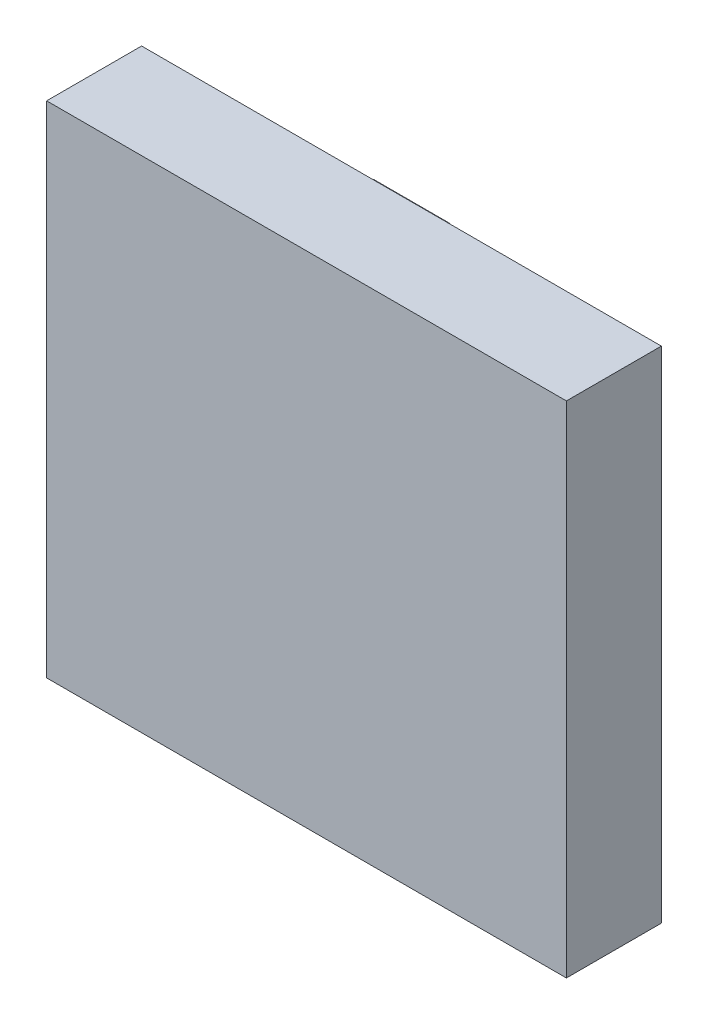
ISO-10303-21;
HEADER;
FILE_DESCRIPTION(('STEP AP214'),'2;1');
FILE_NAME('part.step','',(''),(''),'','','');
FILE_SCHEMA(('AUTOMOTIVE_DESIGN { 1 0 10303 214 1 1 1 1 }'));
ENDSEC;
DATA;
#1=APPLICATION_CONTEXT('core data for automotive mechanical design processes');
#2=APPLICATION_PROTOCOL_DEFINITION('international standard','automotive_design',2000,#1);
#3=PRODUCT_CONTEXT('',#1,'mechanical');
#4=PRODUCT('Part','Part','',(#3));
#5=PRODUCT_RELATED_PRODUCT_CATEGORY('part','',(#4));
#6=PRODUCT_DEFINITION_FORMATION('','',#4);
#7=PRODUCT_DEFINITION_CONTEXT('part definition',#1,'design');
#8=PRODUCT_DEFINITION('design','',#6,#7);
#9=PRODUCT_DEFINITION_SHAPE('','',#8);
#10=(LENGTH_UNIT() NAMED_UNIT(*) SI_UNIT(.MILLI.,.METRE.));
#11=(NAMED_UNIT(*) PLANE_ANGLE_UNIT() SI_UNIT($,.RADIAN.));
#12=(NAMED_UNIT(*) SI_UNIT($,.STERADIAN.) SOLID_ANGLE_UNIT());
#13=UNCERTAINTY_MEASURE_WITH_UNIT(LENGTH_MEASURE(1.E-05),#10,'distance_accuracy_value','');
#14=(GEOMETRIC_REPRESENTATION_CONTEXT(3) GLOBAL_UNCERTAINTY_ASSIGNED_CONTEXT((#13)) GLOBAL_UNIT_ASSIGNED_CONTEXT((#10,
#11,#12)) REPRESENTATION_CONTEXT('',''));
#15=CARTESIAN_POINT('',(0.,0.,0.));
#16=DIRECTION('',(0.,0.,1.));
#17=DIRECTION('',(1.,0.,0.));
#18=AXIS2_PLACEMENT_3D('',#15,#16,#17);
#19=CARTESIAN_POINT('',(0.,0.,1.05));
#20=DIRECTION('',(0.,0.,-1.));
#21=DIRECTION('',(0.,-1.,0.));
#22=AXIS2_PLACEMENT_3D('',#19,#20,#21);
#23=PLANE('',#22);
#24=DIRECTION('',(0.,1.,0.));
#25=VECTOR('',#24,1.);
#26=CARTESIAN_POINT('',(-2.6,-2.5,1.05));
#27=LINE('',#26,#25);
#28=CARTESIAN_POINT('',(-2.6,-2.5,1.05));
#29=VERTEX_POINT('',#28);
#30=CARTESIAN_POINT('',(-2.6,2.5,1.05));
#31=VERTEX_POINT('',#30);
#32=EDGE_CURVE('P0_E25',#29,#31,#27,.T.);
#33=ORIENTED_EDGE('',*,*,#32,.F.);
#34=DIRECTION('',(-1.,0.,0.));
#35=VECTOR('',#34,1.);
#36=CARTESIAN_POINT('',(2.6,-2.5,1.05));
#37=LINE('',#36,#35);
#38=CARTESIAN_POINT('',(2.6,-2.5,1.05));
#39=VERTEX_POINT('',#38);
#40=EDGE_CURVE('P0_E66',#39,#29,#37,.T.);
#41=ORIENTED_EDGE('',*,*,#40,.F.);
#42=DIRECTION('',(0.,-1.,0.));
#43=VECTOR('',#42,1.);
#44=CARTESIAN_POINT('',(2.6,2.5,1.05));
#45=LINE('',#44,#43);
#46=CARTESIAN_POINT('',(2.6,2.5,1.05));
#47=VERTEX_POINT('',#46);
#48=EDGE_CURVE('P0_E69',#47,#39,#45,.T.);
#49=ORIENTED_EDGE('',*,*,#48,.F.);
#50=DIRECTION('',(1.,0.,0.));
#51=VECTOR('',#50,1.);
#52=CARTESIAN_POINT('',(-2.6,2.5,1.05));
#53=LINE('',#52,#51);
#54=EDGE_CURVE('P0_E112',#31,#47,#53,.T.);
#55=ORIENTED_EDGE('',*,*,#54,.F.);
#56=EDGE_LOOP('',(#33,#41,#49,#55));
#57=FACE_BOUND('',#56,.T.);
#58=ADVANCED_FACE('P0_F17',(#57),#23,.F.);
#59=CARTESIAN_POINT('',(0.,0.,0.1));
#60=DIRECTION('',(0.,0.,-1.));
#61=DIRECTION('',(0.,-1.,0.));
#62=AXIS2_PLACEMENT_3D('',#59,#60,#61);
#63=PLANE('',#62);
#64=DIRECTION('',(1.,0.,0.));
#65=VECTOR('',#64,1.);
#66=CARTESIAN_POINT('',(-2.6,2.5,0.1));
#67=LINE('',#66,#65);
#68=CARTESIAN_POINT('',(-2.6,2.5,0.1));
#69=VERTEX_POINT('',#68);
#70=CARTESIAN_POINT('',(2.6,2.5,0.1));
#71=VERTEX_POINT('',#70);
#72=EDGE_CURVE('P0_E90',#69,#71,#67,.T.);
#73=ORIENTED_EDGE('',*,*,#72,.T.);
#74=DIRECTION('',(0.,-1.,0.));
#75=VECTOR('',#74,1.);
#76=CARTESIAN_POINT('',(2.6,2.5,0.1));
#77=LINE('',#76,#75);
#78=CARTESIAN_POINT('',(2.6,-2.5,0.1));
#79=VERTEX_POINT('',#78);
#80=EDGE_CURVE('P0_E75',#71,#79,#77,.T.);
#81=ORIENTED_EDGE('',*,*,#80,.T.);
#82=DIRECTION('',(-1.,0.,0.));
#83=VECTOR('',#82,1.);
#84=CARTESIAN_POINT('',(2.6,-2.5,0.1));
#85=LINE('',#84,#83);
#86=CARTESIAN_POINT('',(-2.6,-2.5,0.1));
#87=VERTEX_POINT('',#86);
#88=EDGE_CURVE('P0_E80',#79,#87,#85,.T.);
#89=ORIENTED_EDGE('',*,*,#88,.T.);
#90=DIRECTION('',(0.,1.,0.));
#91=VECTOR('',#90,1.);
#92=CARTESIAN_POINT('',(-2.6,-2.5,0.1));
#93=LINE('',#92,#91);
#94=EDGE_CURVE('P0_E11',#87,#69,#93,.T.);
#95=ORIENTED_EDGE('',*,*,#94,.T.);
#96=EDGE_LOOP('',(#73,#81,#89,#95));
#97=FACE_BOUND('',#96,.T.);
#98=ADVANCED_FACE('P0_F107',(#97),#63,.T.);
#99=CARTESIAN_POINT('',(-2.6,-2.5,0.1));
#100=DIRECTION('',(-1.,0.,0.));
#101=DIRECTION('',(0.,0.,1.));
#102=AXIS2_PLACEMENT_3D('',#99,#100,#101);
#103=PLANE('',#102);
#104=DIRECTION('',(0.,0.,1.));
#105=VECTOR('',#104,1.);
#106=CARTESIAN_POINT('',(-2.6,-2.5,0.1));
#107=LINE('',#106,#105);
#108=EDGE_CURVE('P0_E74',#87,#29,#107,.T.);
#109=ORIENTED_EDGE('',*,*,#108,.T.);
#110=ORIENTED_EDGE('',*,*,#32,.T.);
#111=DIRECTION('',(0.,0.,1.));
#112=VECTOR('',#111,1.);
#113=CARTESIAN_POINT('',(-2.6,2.5,0.1));
#114=LINE('',#113,#112);
#115=EDGE_CURVE('P0_E111',#69,#31,#114,.T.);
#116=ORIENTED_EDGE('',*,*,#115,.F.);
#117=ORIENTED_EDGE('',*,*,#94,.F.);
#118=EDGE_LOOP('',(#109,#110,#116,#117));
#119=FACE_BOUND('',#118,.T.);
#120=ADVANCED_FACE('P0_F109',(#119),#103,.T.);
#121=CARTESIAN_POINT('',(2.6,-2.5,0.1));
#122=DIRECTION('',(0.,-1.,0.));
#123=DIRECTION('',(0.,0.,-1.));
#124=AXIS2_PLACEMENT_3D('',#121,#122,#123);
#125=PLANE('',#124);
#126=DIRECTION('',(0.,0.,1.));
#127=VECTOR('',#126,1.);
#128=CARTESIAN_POINT('',(2.6,-2.5,0.1));
#129=LINE('',#128,#127);
#130=EDGE_CURVE('P0_E78',#79,#39,#129,.T.);
#131=ORIENTED_EDGE('',*,*,#130,.T.);
#132=ORIENTED_EDGE('',*,*,#40,.T.);
#133=ORIENTED_EDGE('',*,*,#108,.F.);
#134=ORIENTED_EDGE('',*,*,#88,.F.);
#135=EDGE_LOOP('',(#131,#132,#133,#134));
#136=FACE_BOUND('',#135,.T.);
#137=ADVANCED_FACE('P0_F79',(#136),#125,.T.);
#138=CARTESIAN_POINT('',(2.6,2.5,0.1));
#139=DIRECTION('',(1.,0.,0.));
#140=DIRECTION('',(0.,1.,0.));
#141=AXIS2_PLACEMENT_3D('',#138,#139,#140);
#142=PLANE('',#141);
#143=DIRECTION('',(0.,0.,1.));
#144=VECTOR('',#143,1.);
#145=CARTESIAN_POINT('',(2.6,2.5,0.1));
#146=LINE('',#145,#144);
#147=EDGE_CURVE('P0_E87',#71,#47,#146,.T.);
#148=ORIENTED_EDGE('',*,*,#147,.T.);
#149=ORIENTED_EDGE('',*,*,#48,.T.);
#150=ORIENTED_EDGE('',*,*,#130,.F.);
#151=ORIENTED_EDGE('',*,*,#80,.F.);
#152=EDGE_LOOP('',(#148,#149,#150,#151));
#153=FACE_BOUND('',#152,.T.);
#154=ADVANCED_FACE('P0_F85',(#153),#142,.T.);
#155=CARTESIAN_POINT('',(-2.6,2.5,0.1));
#156=DIRECTION('',(0.,1.,0.));
#157=DIRECTION('',(1.,0.,0.));
#158=AXIS2_PLACEMENT_3D('',#155,#156,#157);
#159=PLANE('',#158);
#160=ORIENTED_EDGE('',*,*,#115,.T.);
#161=ORIENTED_EDGE('',*,*,#54,.T.);
#162=ORIENTED_EDGE('',*,*,#147,.F.);
#163=ORIENTED_EDGE('',*,*,#72,.F.);
#164=EDGE_LOOP('',(#160,#161,#162,#163));
#165=FACE_BOUND('',#164,.T.);
#166=ADVANCED_FACE('P0_F116',(#165),#159,.T.);
#167=CLOSED_SHELL('',(#58,#98,#120,#137,#154,#166));
#168=MANIFOLD_SOLID_BREP('P0_B1',#167);
#169=CARTESIAN_POINT('',(-2.4275,-2.0575,0.1));
#170=DIRECTION('',(0.,0.,1.));
#171=DIRECTION('',(1.,0.,0.));
#172=AXIS2_PLACEMENT_3D('',#169,#170,#171);
#173=PLANE('',#172);
#174=DIRECTION('',(0.,1.,0.));
#175=VECTOR('',#174,1.);
#176=CARTESIAN_POINT('',(-2.4275,-2.0575,0.1));
#177=LINE('',#176,#175);
#178=CARTESIAN_POINT('',(-2.4275,-2.0575,0.1));
#179=VERTEX_POINT('',#178);
#180=CARTESIAN_POINT('',(-2.4275,2.0575,0.1));
#181=VERTEX_POINT('',#180);
#182=EDGE_CURVE('P1_E87',#179,#181,#177,.T.);
#183=ORIENTED_EDGE('',*,*,#182,.F.);
#184=DIRECTION('',(1.,0.,0.));
#185=VECTOR('',#184,1.);
#186=CARTESIAN_POINT('',(-2.4275,-2.0575,0.1));
#187=LINE('',#186,#185);
#188=CARTESIAN_POINT('',(-1.0475,-2.0575,0.1));
#189=VERTEX_POINT('',#188);
#190=EDGE_CURVE('P1_E70',#179,#189,#187,.T.);
#191=ORIENTED_EDGE('',*,*,#190,.T.);
#192=DIRECTION('',(0.,1.,0.));
#193=VECTOR('',#192,1.);
#194=CARTESIAN_POINT('',(-1.0475,-2.0575,0.1));
#195=LINE('',#194,#193);
#196=CARTESIAN_POINT('',(-1.0475,2.0575,0.1));
#197=VERTEX_POINT('',#196);
#198=EDGE_CURVE('P1_E82',#189,#197,#195,.T.);
#199=ORIENTED_EDGE('',*,*,#198,.T.);
#200=DIRECTION('',(1.,0.,0.));
#201=VECTOR('',#200,1.);
#202=CARTESIAN_POINT('',(-2.4275,2.0575,0.1));
#203=LINE('',#202,#201);
#204=EDGE_CURVE('P1_E11',#181,#197,#203,.T.);
#205=ORIENTED_EDGE('',*,*,#204,.F.);
#206=EDGE_LOOP('',(#183,#191,#199,#205));
#207=FACE_BOUND('',#206,.T.);
#208=ADVANCED_FACE('P1_F17',(#207),#173,.T.);
#209=CARTESIAN_POINT('',(-2.4275,-2.0575,0.));
#210=DIRECTION('',(0.,0.,1.));
#211=DIRECTION('',(1.,0.,0.));
#212=AXIS2_PLACEMENT_3D('',#209,#210,#211);
#213=PLANE('',#212);
#214=DIRECTION('',(1.,0.,0.));
#215=VECTOR('',#214,1.);
#216=CARTESIAN_POINT('',(-2.4275,2.0575,0.));
#217=LINE('',#216,#215);
#218=CARTESIAN_POINT('',(-2.4275,2.0575,0.));
#219=VERTEX_POINT('',#218);
#220=CARTESIAN_POINT('',(-1.0475,2.0575,0.));
#221=VERTEX_POINT('',#220);
#222=EDGE_CURVE('P1_E25',#219,#221,#217,.T.);
#223=ORIENTED_EDGE('',*,*,#222,.T.);
#224=DIRECTION('',(0.,1.,0.));
#225=VECTOR('',#224,1.);
#226=CARTESIAN_POINT('',(-1.0475,-2.0575,0.));
#227=LINE('',#226,#225);
#228=CARTESIAN_POINT('',(-1.0475,-2.0575,0.));
#229=VERTEX_POINT('',#228);
#230=EDGE_CURVE('P1_E109',#229,#221,#227,.T.);
#231=ORIENTED_EDGE('',*,*,#230,.F.);
#232=DIRECTION('',(1.,0.,0.));
#233=VECTOR('',#232,1.);
#234=CARTESIAN_POINT('',(-2.4275,-2.0575,0.));
#235=LINE('',#234,#233);
#236=CARTESIAN_POINT('',(-2.4275,-2.0575,0.));
#237=VERTEX_POINT('',#236);
#238=EDGE_CURVE('P1_E81',#237,#229,#235,.T.);
#239=ORIENTED_EDGE('',*,*,#238,.F.);
#240=DIRECTION('',(0.,1.,0.));
#241=VECTOR('',#240,1.);
#242=CARTESIAN_POINT('',(-2.4275,-2.0575,0.));
#243=LINE('',#242,#241);
#244=EDGE_CURVE('P1_E88',#237,#219,#243,.T.);
#245=ORIENTED_EDGE('',*,*,#244,.T.);
#246=EDGE_LOOP('',(#223,#231,#239,#245));
#247=FACE_BOUND('',#246,.T.);
#248=ADVANCED_FACE('P1_F120',(#247),#213,.F.);
#249=CARTESIAN_POINT('',(-2.4275,2.0575,0.));
#250=DIRECTION('',(0.,1.,0.));
#251=DIRECTION('',(1.,0.,0.));
#252=AXIS2_PLACEMENT_3D('',#249,#250,#251);
#253=PLANE('',#252);
#254=ORIENTED_EDGE('',*,*,#222,.F.);
#255=DIRECTION('',(0.,0.,1.));
#256=VECTOR('',#255,1.);
#257=CARTESIAN_POINT('',(-2.4275,2.0575,0.));
#258=LINE('',#257,#256);
#259=EDGE_CURVE('P1_E92',#219,#181,#258,.T.);
#260=ORIENTED_EDGE('',*,*,#259,.T.);
#261=ORIENTED_EDGE('',*,*,#204,.T.);
#262=DIRECTION('',(0.,0.,1.));
#263=VECTOR('',#262,1.);
#264=CARTESIAN_POINT('',(-1.0475,2.0575,0.));
#265=LINE('',#264,#263);
#266=EDGE_CURVE('P1_E101',#221,#197,#265,.T.);
#267=ORIENTED_EDGE('',*,*,#266,.F.);
#268=EDGE_LOOP('',(#254,#260,#261,#267));
#269=FACE_BOUND('',#268,.T.);
#270=ADVANCED_FACE('P1_F119',(#269),#253,.T.);
#271=CARTESIAN_POINT('',(-2.4275,-2.0575,0.));
#272=DIRECTION('',(0.,1.,0.));
#273=DIRECTION('',(1.,0.,0.));
#274=AXIS2_PLACEMENT_3D('',#271,#272,#273);
#275=PLANE('',#274);
#276=DIRECTION('',(0.,0.,1.));
#277=VECTOR('',#276,1.);
#278=CARTESIAN_POINT('',(-1.0475,-2.0575,0.));
#279=LINE('',#278,#277);
#280=EDGE_CURVE('P1_E76',#229,#189,#279,.T.);
#281=ORIENTED_EDGE('',*,*,#280,.T.);
#282=ORIENTED_EDGE('',*,*,#190,.F.);
#283=DIRECTION('',(0.,0.,1.));
#284=VECTOR('',#283,1.);
#285=CARTESIAN_POINT('',(-2.4275,-2.0575,0.));
#286=LINE('',#285,#284);
#287=EDGE_CURVE('P1_E73',#237,#179,#286,.T.);
#288=ORIENTED_EDGE('',*,*,#287,.F.);
#289=ORIENTED_EDGE('',*,*,#238,.T.);
#290=EDGE_LOOP('',(#281,#282,#288,#289));
#291=FACE_BOUND('',#290,.T.);
#292=ADVANCED_FACE('P1_F72',(#291),#275,.F.);
#293=CARTESIAN_POINT('',(-1.0475,-2.0575,0.));
#294=DIRECTION('',(1.,0.,0.));
#295=DIRECTION('',(0.,1.,0.));
#296=AXIS2_PLACEMENT_3D('',#293,#294,#295);
#297=PLANE('',#296);
#298=ORIENTED_EDGE('',*,*,#280,.F.);
#299=ORIENTED_EDGE('',*,*,#230,.T.);
#300=ORIENTED_EDGE('',*,*,#266,.T.);
#301=ORIENTED_EDGE('',*,*,#198,.F.);
#302=EDGE_LOOP('',(#298,#299,#300,#301));
#303=FACE_BOUND('',#302,.T.);
#304=ADVANCED_FACE('P1_F118',(#303),#297,.T.);
#305=CARTESIAN_POINT('',(-2.4275,-2.0575,0.));
#306=DIRECTION('',(1.,0.,0.));
#307=DIRECTION('',(0.,1.,0.));
#308=AXIS2_PLACEMENT_3D('',#305,#306,#307);
#309=PLANE('',#308);
#310=ORIENTED_EDGE('',*,*,#182,.T.);
#311=ORIENTED_EDGE('',*,*,#259,.F.);
#312=ORIENTED_EDGE('',*,*,#244,.F.);
#313=ORIENTED_EDGE('',*,*,#287,.T.);
#314=EDGE_LOOP('',(#310,#311,#312,#313));
#315=FACE_BOUND('',#314,.T.);
#316=ADVANCED_FACE('P1_F85',(#315),#309,.F.);
#317=CLOSED_SHELL('',(#208,#248,#270,#292,#304,#316));
#318=MANIFOLD_SOLID_BREP('P1_B1',#317);
#319=CARTESIAN_POINT('',(1.0475,-2.0575,0.1));
#320=DIRECTION('',(0.,0.,1.));
#321=DIRECTION('',(1.,0.,0.));
#322=AXIS2_PLACEMENT_3D('',#319,#320,#321);
#323=PLANE('',#322);
#324=DIRECTION('',(0.,1.,0.));
#325=VECTOR('',#324,1.);
#326=CARTESIAN_POINT('',(1.0475,-2.0575,0.1));
#327=LINE('',#326,#325);
#328=CARTESIAN_POINT('',(1.0475,-2.0575,0.1));
#329=VERTEX_POINT('',#328);
#330=CARTESIAN_POINT('',(1.0475,2.0575,0.1));
#331=VERTEX_POINT('',#330);
#332=EDGE_CURVE('P2_E89',#329,#331,#327,.T.);
#333=ORIENTED_EDGE('',*,*,#332,.F.);
#334=DIRECTION('',(1.,0.,0.));
#335=VECTOR('',#334,1.);
#336=CARTESIAN_POINT('',(1.0475,-2.0575,0.1));
#337=LINE('',#336,#335);
#338=CARTESIAN_POINT('',(2.4275,-2.0575,0.1));
#339=VERTEX_POINT('',#338);
#340=EDGE_CURVE('P2_E71',#329,#339,#337,.T.);
#341=ORIENTED_EDGE('',*,*,#340,.T.);
#342=DIRECTION('',(0.,1.,0.));
#343=VECTOR('',#342,1.);
#344=CARTESIAN_POINT('',(2.4275,-2.0575,0.1));
#345=LINE('',#344,#343);
#346=CARTESIAN_POINT('',(2.4275,2.0575,0.1));
#347=VERTEX_POINT('',#346);
#348=EDGE_CURVE('P2_E83',#339,#347,#345,.T.);
#349=ORIENTED_EDGE('',*,*,#348,.T.);
#350=DIRECTION('',(1.,0.,0.));
#351=VECTOR('',#350,1.);
#352=CARTESIAN_POINT('',(1.0475,2.0575,0.1));
#353=LINE('',#352,#351);
#354=EDGE_CURVE('P2_E11',#331,#347,#353,.T.);
#355=ORIENTED_EDGE('',*,*,#354,.F.);
#356=EDGE_LOOP('',(#333,#341,#349,#355));
#357=FACE_BOUND('',#356,.T.);
#358=ADVANCED_FACE('P2_F17',(#357),#323,.T.);
#359=CARTESIAN_POINT('',(1.0475,-2.0575,0.));
#360=DIRECTION('',(0.,0.,1.));
#361=DIRECTION('',(1.,0.,0.));
#362=AXIS2_PLACEMENT_3D('',#359,#360,#361);
#363=PLANE('',#362);
#364=DIRECTION('',(1.,0.,0.));
#365=VECTOR('',#364,1.);
#366=CARTESIAN_POINT('',(1.0475,2.0575,0.));
#367=LINE('',#366,#365);
#368=CARTESIAN_POINT('',(1.0475,2.0575,0.));
#369=VERTEX_POINT('',#368);
#370=CARTESIAN_POINT('',(2.4275,2.0575,0.));
#371=VERTEX_POINT('',#370);
#372=EDGE_CURVE('P2_E20',#369,#371,#367,.T.);
#373=ORIENTED_EDGE('',*,*,#372,.T.);
#374=DIRECTION('',(0.,1.,0.));
#375=VECTOR('',#374,1.);
#376=CARTESIAN_POINT('',(2.4275,-2.0575,0.));
#377=LINE('',#376,#375);
#378=CARTESIAN_POINT('',(2.4275,-2.0575,0.));
#379=VERTEX_POINT('',#378);
#380=EDGE_CURVE('P2_E104',#379,#371,#377,.T.);
#381=ORIENTED_EDGE('',*,*,#380,.F.);
#382=DIRECTION('',(1.,0.,0.));
#383=VECTOR('',#382,1.);
#384=CARTESIAN_POINT('',(1.0475,-2.0575,0.));
#385=LINE('',#384,#383);
#386=CARTESIAN_POINT('',(1.0475,-2.0575,0.));
#387=VERTEX_POINT('',#386);
#388=EDGE_CURVE('P2_E82',#387,#379,#385,.T.);
#389=ORIENTED_EDGE('',*,*,#388,.F.);
#390=DIRECTION('',(0.,1.,0.));
#391=VECTOR('',#390,1.);
#392=CARTESIAN_POINT('',(1.0475,-2.0575,0.));
#393=LINE('',#392,#391);
#394=EDGE_CURVE('P2_E90',#387,#369,#393,.T.);
#395=ORIENTED_EDGE('',*,*,#394,.T.);
#396=EDGE_LOOP('',(#373,#381,#389,#395));
#397=FACE_BOUND('',#396,.T.);
#398=ADVANCED_FACE('P2_F149',(#397),#363,.F.);
#399=CARTESIAN_POINT('',(1.0475,2.0575,0.));
#400=DIRECTION('',(0.,1.,0.));
#401=DIRECTION('',(1.,0.,0.));
#402=AXIS2_PLACEMENT_3D('',#399,#400,#401);
#403=PLANE('',#402);
#404=ORIENTED_EDGE('',*,*,#372,.F.);
#405=DIRECTION('',(0.,0.,1.));
#406=VECTOR('',#405,1.);
#407=CARTESIAN_POINT('',(1.0475,2.0575,0.));
#408=LINE('',#407,#406);
#409=EDGE_CURVE('P2_E94',#369,#331,#408,.T.);
#410=ORIENTED_EDGE('',*,*,#409,.T.);
#411=ORIENTED_EDGE('',*,*,#354,.T.);
#412=DIRECTION('',(0.,0.,1.));
#413=VECTOR('',#412,1.);
#414=CARTESIAN_POINT('',(2.4275,2.0575,0.));
#415=LINE('',#414,#413);
#416=EDGE_CURVE('P2_E108',#371,#347,#415,.T.);
#417=ORIENTED_EDGE('',*,*,#416,.F.);
#418=EDGE_LOOP('',(#404,#410,#411,#417));
#419=FACE_BOUND('',#418,.T.);
#420=ADVANCED_FACE('P2_F141',(#419),#403,.T.);
#421=CARTESIAN_POINT('',(1.0475,-2.0575,0.));
#422=DIRECTION('',(0.,1.,0.));
#423=DIRECTION('',(1.,0.,0.));
#424=AXIS2_PLACEMENT_3D('',#421,#422,#423);
#425=PLANE('',#424);
#426=DIRECTION('',(0.,0.,1.));
#427=VECTOR('',#426,1.);
#428=CARTESIAN_POINT('',(2.4275,-2.0575,0.));
#429=LINE('',#428,#427);
#430=EDGE_CURVE('P2_E77',#379,#339,#429,.T.);
#431=ORIENTED_EDGE('',*,*,#430,.T.);
#432=ORIENTED_EDGE('',*,*,#340,.F.);
#433=DIRECTION('',(0.,0.,1.));
#434=VECTOR('',#433,1.);
#435=CARTESIAN_POINT('',(1.0475,-2.0575,0.));
#436=LINE('',#435,#434);
#437=EDGE_CURVE('P2_E74',#387,#329,#436,.T.);
#438=ORIENTED_EDGE('',*,*,#437,.F.);
#439=ORIENTED_EDGE('',*,*,#388,.T.);
#440=EDGE_LOOP('',(#431,#432,#438,#439));
#441=FACE_BOUND('',#440,.T.);
#442=ADVANCED_FACE('P2_F73',(#441),#425,.F.);
#443=CARTESIAN_POINT('',(2.4275,-2.0575,0.));
#444=DIRECTION('',(1.,0.,0.));
#445=DIRECTION('',(0.,1.,0.));
#446=AXIS2_PLACEMENT_3D('',#443,#444,#445);
#447=PLANE('',#446);
#448=ORIENTED_EDGE('',*,*,#430,.F.);
#449=ORIENTED_EDGE('',*,*,#380,.T.);
#450=ORIENTED_EDGE('',*,*,#416,.T.);
#451=ORIENTED_EDGE('',*,*,#348,.F.);
#452=EDGE_LOOP('',(#448,#449,#450,#451));
#453=FACE_BOUND('',#452,.T.);
#454=ADVANCED_FACE('P2_F120',(#453),#447,.T.);
#455=CARTESIAN_POINT('',(1.0475,-2.0575,0.));
#456=DIRECTION('',(1.,0.,0.));
#457=DIRECTION('',(0.,1.,0.));
#458=AXIS2_PLACEMENT_3D('',#455,#456,#457);
#459=PLANE('',#458);
#460=ORIENTED_EDGE('',*,*,#332,.T.);
#461=ORIENTED_EDGE('',*,*,#409,.F.);
#462=ORIENTED_EDGE('',*,*,#394,.F.);
#463=ORIENTED_EDGE('',*,*,#437,.T.);
#464=EDGE_LOOP('',(#460,#461,#462,#463));
#465=FACE_BOUND('',#464,.T.);
#466=ADVANCED_FACE('P2_F87',(#465),#459,.F.);
#467=CLOSED_SHELL('',(#358,#398,#420,#442,#454,#466));
#468=MANIFOLD_SOLID_BREP('P2_B1',#467);
#469=CARTESIAN_POINT('',(-0.38,-2.405,0.1));
#470=DIRECTION('',(0.,0.,1.));
#471=DIRECTION('',(1.,0.,0.));
#472=AXIS2_PLACEMENT_3D('',#469,#470,#471);
#473=PLANE('',#472);
#474=DIRECTION('',(0.,1.,0.));
#475=VECTOR('',#474,1.);
#476=CARTESIAN_POINT('',(-0.38,-2.405,0.1));
#477=LINE('',#476,#475);
#478=CARTESIAN_POINT('',(-0.38,-2.405,0.1));
#479=VERTEX_POINT('',#478);
#480=CARTESIAN_POINT('',(-0.38,2.405,0.1));
#481=VERTEX_POINT('',#480);
#482=EDGE_CURVE('P3_E89',#479,#481,#477,.T.);
#483=ORIENTED_EDGE('',*,*,#482,.F.);
#484=DIRECTION('',(1.,0.,0.));
#485=VECTOR('',#484,1.);
#486=CARTESIAN_POINT('',(-0.38,-2.405,0.1));
#487=LINE('',#486,#485);
#488=CARTESIAN_POINT('',(0.38,-2.405,0.1));
#489=VERTEX_POINT('',#488);
#490=EDGE_CURVE('P3_E71',#479,#489,#487,.T.);
#491=ORIENTED_EDGE('',*,*,#490,.T.);
#492=DIRECTION('',(0.,1.,0.));
#493=VECTOR('',#492,1.);
#494=CARTESIAN_POINT('',(0.38,-2.405,0.1));
#495=LINE('',#494,#493);
#496=CARTESIAN_POINT('',(0.38,2.405,0.1));
#497=VERTEX_POINT('',#496);
#498=EDGE_CURVE('P3_E83',#489,#497,#495,.T.);
#499=ORIENTED_EDGE('',*,*,#498,.T.);
#500=DIRECTION('',(1.,0.,0.));
#501=VECTOR('',#500,1.);
#502=CARTESIAN_POINT('',(-0.38,2.405,0.1));
#503=LINE('',#502,#501);
#504=EDGE_CURVE('P3_E11',#481,#497,#503,.T.);
#505=ORIENTED_EDGE('',*,*,#504,.F.);
#506=EDGE_LOOP('',(#483,#491,#499,#505));
#507=FACE_BOUND('',#506,.T.);
#508=ADVANCED_FACE('P3_F17',(#507),#473,.T.);
#509=CARTESIAN_POINT('',(-0.38,-2.405,0.));
#510=DIRECTION('',(0.,0.,1.));
#511=DIRECTION('',(1.,0.,0.));
#512=AXIS2_PLACEMENT_3D('',#509,#510,#511);
#513=PLANE('',#512);
#514=DIRECTION('',(1.,0.,0.));
#515=VECTOR('',#514,1.);
#516=CARTESIAN_POINT('',(-0.38,2.405,0.));
#517=LINE('',#516,#515);
#518=CARTESIAN_POINT('',(-0.38,2.405,0.));
#519=VERTEX_POINT('',#518);
#520=CARTESIAN_POINT('',(0.38,2.405,0.));
#521=VERTEX_POINT('',#520);
#522=EDGE_CURVE('P3_E20',#519,#521,#517,.T.);
#523=ORIENTED_EDGE('',*,*,#522,.T.);
#524=DIRECTION('',(0.,1.,0.));
#525=VECTOR('',#524,1.);
#526=CARTESIAN_POINT('',(0.38,-2.405,0.));
#527=LINE('',#526,#525);
#528=CARTESIAN_POINT('',(0.38,-2.405,0.));
#529=VERTEX_POINT('',#528);
#530=EDGE_CURVE('P3_E101',#529,#521,#527,.T.);
#531=ORIENTED_EDGE('',*,*,#530,.F.);
#532=DIRECTION('',(1.,0.,0.));
#533=VECTOR('',#532,1.);
#534=CARTESIAN_POINT('',(-0.38,-2.405,0.));
#535=LINE('',#534,#533);
#536=CARTESIAN_POINT('',(-0.38,-2.405,0.));
#537=VERTEX_POINT('',#536);
#538=EDGE_CURVE('P3_E82',#537,#529,#535,.T.);
#539=ORIENTED_EDGE('',*,*,#538,.F.);
#540=DIRECTION('',(0.,1.,0.));
#541=VECTOR('',#540,1.);
#542=CARTESIAN_POINT('',(-0.38,-2.405,0.));
#543=LINE('',#542,#541);
#544=EDGE_CURVE('P3_E90',#537,#519,#543,.T.);
#545=ORIENTED_EDGE('',*,*,#544,.T.);
#546=EDGE_LOOP('',(#523,#531,#539,#545));
#547=FACE_BOUND('',#546,.T.);
#548=ADVANCED_FACE('P3_F134',(#547),#513,.F.);
#549=CARTESIAN_POINT('',(-0.38,2.405,0.));
#550=DIRECTION('',(0.,1.,0.));
#551=DIRECTION('',(1.,0.,0.));
#552=AXIS2_PLACEMENT_3D('',#549,#550,#551);
#553=PLANE('',#552);
#554=ORIENTED_EDGE('',*,*,#522,.F.);
#555=DIRECTION('',(0.,0.,1.));
#556=VECTOR('',#555,1.);
#557=CARTESIAN_POINT('',(-0.38,2.405,0.));
#558=LINE('',#557,#556);
#559=EDGE_CURVE('P3_E94',#519,#481,#558,.T.);
#560=ORIENTED_EDGE('',*,*,#559,.T.);
#561=ORIENTED_EDGE('',*,*,#504,.T.);
#562=DIRECTION('',(0.,0.,1.));
#563=VECTOR('',#562,1.);
#564=CARTESIAN_POINT('',(0.38,2.405,0.));
#565=LINE('',#564,#563);
#566=EDGE_CURVE('P3_E105',#521,#497,#565,.T.);
#567=ORIENTED_EDGE('',*,*,#566,.F.);
#568=EDGE_LOOP('',(#554,#560,#561,#567));
#569=FACE_BOUND('',#568,.T.);
#570=ADVANCED_FACE('P3_F130',(#569),#553,.T.);
#571=CARTESIAN_POINT('',(-0.38,-2.405,0.));
#572=DIRECTION('',(0.,1.,0.));
#573=DIRECTION('',(1.,0.,0.));
#574=AXIS2_PLACEMENT_3D('',#571,#572,#573);
#575=PLANE('',#574);
#576=DIRECTION('',(0.,0.,1.));
#577=VECTOR('',#576,1.);
#578=CARTESIAN_POINT('',(0.38,-2.405,0.));
#579=LINE('',#578,#577);
#580=EDGE_CURVE('P3_E77',#529,#489,#579,.T.);
#581=ORIENTED_EDGE('',*,*,#580,.T.);
#582=ORIENTED_EDGE('',*,*,#490,.F.);
#583=DIRECTION('',(0.,0.,1.));
#584=VECTOR('',#583,1.);
#585=CARTESIAN_POINT('',(-0.38,-2.405,0.));
#586=LINE('',#585,#584);
#587=EDGE_CURVE('P3_E74',#537,#479,#586,.T.);
#588=ORIENTED_EDGE('',*,*,#587,.F.);
#589=ORIENTED_EDGE('',*,*,#538,.T.);
#590=EDGE_LOOP('',(#581,#582,#588,#589));
#591=FACE_BOUND('',#590,.T.);
#592=ADVANCED_FACE('P3_F73',(#591),#575,.F.);
#593=CARTESIAN_POINT('',(0.38,-2.405,0.));
#594=DIRECTION('',(1.,0.,0.));
#595=DIRECTION('',(0.,1.,0.));
#596=AXIS2_PLACEMENT_3D('',#593,#594,#595);
#597=PLANE('',#596);
#598=ORIENTED_EDGE('',*,*,#580,.F.);
#599=ORIENTED_EDGE('',*,*,#530,.T.);
#600=ORIENTED_EDGE('',*,*,#566,.T.);
#601=ORIENTED_EDGE('',*,*,#498,.F.);
#602=EDGE_LOOP('',(#598,#599,#600,#601));
#603=FACE_BOUND('',#602,.T.);
#604=ADVANCED_FACE('P3_F124',(#603),#597,.T.);
#605=CARTESIAN_POINT('',(-0.38,-2.405,0.));
#606=DIRECTION('',(1.,0.,0.));
#607=DIRECTION('',(0.,1.,0.));
#608=AXIS2_PLACEMENT_3D('',#605,#606,#607);
#609=PLANE('',#608);
#610=ORIENTED_EDGE('',*,*,#482,.T.);
#611=ORIENTED_EDGE('',*,*,#559,.F.);
#612=ORIENTED_EDGE('',*,*,#544,.F.);
#613=ORIENTED_EDGE('',*,*,#587,.T.);
#614=EDGE_LOOP('',(#610,#611,#612,#613));
#615=FACE_BOUND('',#614,.T.);
#616=ADVANCED_FACE('P3_F87',(#615),#609,.F.);
#617=CLOSED_SHELL('',(#508,#548,#570,#592,#604,#616));
#618=MANIFOLD_SOLID_BREP('P3_B1',#617);
#619=ADVANCED_BREP_SHAPE_REPRESENTATION('',(#18,#168,#318,#468,#618),#14);
#620=SHAPE_DEFINITION_REPRESENTATION(#9,#619);
ENDSEC;
END-ISO-10303-21;
